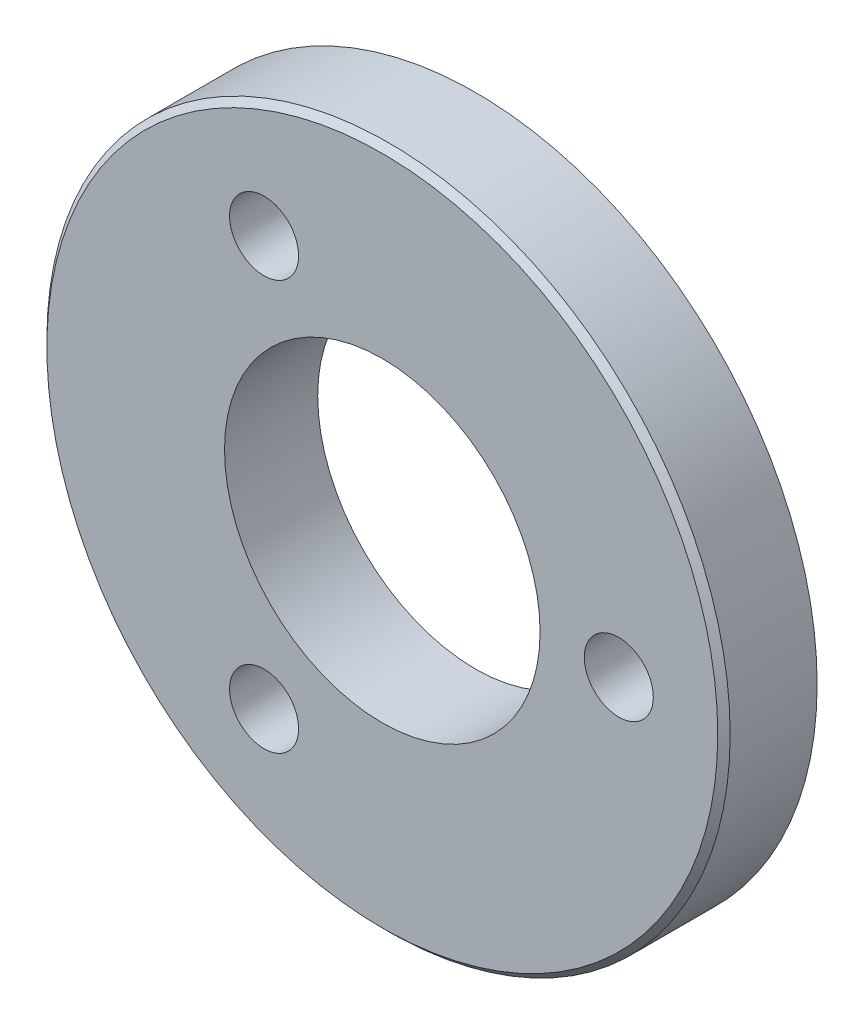
ISO-10303-21;
HEADER;
FILE_DESCRIPTION(('STEP AP214'),'2;1');
FILE_NAME('part.step','',(''),(''),'','','');
FILE_SCHEMA(('AUTOMOTIVE_DESIGN { 1 0 10303 214 1 1 1 1 }'));
ENDSEC;
DATA;
#1=APPLICATION_CONTEXT('core data for automotive mechanical design processes');
#2=APPLICATION_PROTOCOL_DEFINITION('international standard','automotive_design',2000,#1);
#3=PRODUCT_CONTEXT('',#1,'mechanical');
#4=PRODUCT('Part','Part','',(#3));
#5=PRODUCT_RELATED_PRODUCT_CATEGORY('part','',(#4));
#6=PRODUCT_DEFINITION_FORMATION('','',#4);
#7=PRODUCT_DEFINITION_CONTEXT('part definition',#1,'design');
#8=PRODUCT_DEFINITION('design','',#6,#7);
#9=PRODUCT_DEFINITION_SHAPE('','',#8);
#10=(LENGTH_UNIT() NAMED_UNIT(*) SI_UNIT(.MILLI.,.METRE.));
#11=(NAMED_UNIT(*) PLANE_ANGLE_UNIT() SI_UNIT($,.RADIAN.));
#12=(NAMED_UNIT(*) SI_UNIT($,.STERADIAN.) SOLID_ANGLE_UNIT());
#13=UNCERTAINTY_MEASURE_WITH_UNIT(LENGTH_MEASURE(1.E-05),#10,'distance_accuracy_value','');
#14=(GEOMETRIC_REPRESENTATION_CONTEXT(3) GLOBAL_UNCERTAINTY_ASSIGNED_CONTEXT((#13)) GLOBAL_UNIT_ASSIGNED_CONTEXT((#10,
#11,#12)) REPRESENTATION_CONTEXT('',''));
#15=CARTESIAN_POINT('',(0.,0.,0.));
#16=DIRECTION('',(0.,0.,1.));
#17=DIRECTION('',(1.,0.,0.));
#18=AXIS2_PLACEMENT_3D('',#15,#16,#17);
#19=CARTESIAN_POINT('',(0.,0.,7.5));
#20=DIRECTION('',(0.,0.,1.));
#21=DIRECTION('',(1.,0.,0.));
#22=AXIS2_PLACEMENT_3D('',#19,#20,#21);
#23=PLANE('',#22);
#24=CARTESIAN_POINT('',(0.,0.,7.5));
#25=DIRECTION('',(0.,0.,1.));
#26=DIRECTION('',(1.,0.,0.));
#27=AXIS2_PLACEMENT_3D('',#24,#25,#26);
#28=CIRCLE('',#27,27.);
#29=CARTESIAN_POINT('',(27.,0.,7.5));
#30=VERTEX_POINT('',#29);
#31=EDGE_CURVE('E56',#30,#30,#28,.T.);
#32=ORIENTED_EDGE('',*,*,#31,.T.);
#33=EDGE_LOOP('',(#32));
#34=FACE_BOUND('',#33,.T.);
#35=CARTESIAN_POINT('',(-9.51706249999936,-16.4840357888085,7.5));
#36=DIRECTION('',(0.,0.,1.));
#37=DIRECTION('',(1.,0.,0.));
#38=AXIS2_PLACEMENT_3D('',#35,#36,#37);
#39=CIRCLE('',#38,2.778125);
#40=CARTESIAN_POINT('',(-6.73893749999936,-16.4840357888085,7.5));
#41=VERTEX_POINT('',#40);
#42=EDGE_CURVE('E81',#41,#41,#39,.T.);
#43=ORIENTED_EDGE('',*,*,#42,.F.);
#44=EDGE_LOOP('',(#43));
#45=FACE_BOUND('',#44,.T.);
#46=CARTESIAN_POINT('',(-9.51706249999937,16.4840357888085,7.5));
#47=DIRECTION('',(0.,0.,1.));
#48=DIRECTION('',(1.,0.,0.));
#49=AXIS2_PLACEMENT_3D('',#46,#47,#48);
#50=CIRCLE('',#49,2.778125);
#51=CARTESIAN_POINT('',(-6.73893749999937,16.4840357888085,7.5));
#52=VERTEX_POINT('',#51);
#53=EDGE_CURVE('E66',#52,#52,#50,.T.);
#54=ORIENTED_EDGE('',*,*,#53,.F.);
#55=EDGE_LOOP('',(#54));
#56=FACE_BOUND('',#55,.T.);
#57=CARTESIAN_POINT('',(19.0341250000006,0.,7.5));
#58=DIRECTION('',(0.,0.,1.));
#59=DIRECTION('',(1.,0.,0.));
#60=AXIS2_PLACEMENT_3D('',#57,#58,#59);
#61=CIRCLE('',#60,2.778125);
#62=CARTESIAN_POINT('',(21.8122500000006,0.,7.5));
#63=VERTEX_POINT('',#62);
#64=EDGE_CURVE('E73',#63,#63,#61,.T.);
#65=ORIENTED_EDGE('',*,*,#64,.F.);
#66=EDGE_LOOP('',(#65));
#67=FACE_BOUND('',#66,.T.);
#68=CARTESIAN_POINT('',(0.,0.,7.5));
#69=DIRECTION('',(0.,0.,1.));
#70=DIRECTION('',(1.,0.,0.));
#71=AXIS2_PLACEMENT_3D('',#68,#69,#70);
#72=CIRCLE('',#71,12.7);
#73=CARTESIAN_POINT('',(12.7,0.,7.5));
#74=VERTEX_POINT('',#73);
#75=EDGE_CURVE('E89',#74,#74,#72,.T.);
#76=ORIENTED_EDGE('',*,*,#75,.F.);
#77=EDGE_LOOP('',(#76));
#78=FACE_BOUND('',#77,.T.);
#79=ADVANCED_FACE('F47',(#34,#45,#56,#67,#78),#23,.T.);
#80=CARTESIAN_POINT('',(0.,0.,0.));
#81=DIRECTION('',(0.,0.,1.));
#82=DIRECTION('',(1.,0.,0.));
#83=AXIS2_PLACEMENT_3D('',#80,#81,#82);
#84=PLANE('',#83);
#85=CARTESIAN_POINT('',(0.,0.,0.));
#86=DIRECTION('',(0.,0.,1.));
#87=DIRECTION('',(1.,0.,0.));
#88=AXIS2_PLACEMENT_3D('',#85,#86,#87);
#89=CIRCLE('',#88,27.5);
#90=CARTESIAN_POINT('',(27.5,0.,0.));
#91=VERTEX_POINT('',#90);
#92=EDGE_CURVE('E61',#91,#91,#89,.T.);
#93=ORIENTED_EDGE('',*,*,#92,.F.);
#94=EDGE_LOOP('',(#93));
#95=FACE_BOUND('',#94,.T.);
#96=CARTESIAN_POINT('',(-9.51706249999937,16.4840357888085,0.));
#97=DIRECTION('',(0.,0.,1.));
#98=DIRECTION('',(1.,0.,0.));
#99=AXIS2_PLACEMENT_3D('',#96,#97,#98);
#100=CIRCLE('',#99,2.778125);
#101=CARTESIAN_POINT('',(-6.73893749999937,16.4840357888085,0.));
#102=VERTEX_POINT('',#101);
#103=EDGE_CURVE('E69',#102,#102,#100,.T.);
#104=ORIENTED_EDGE('',*,*,#103,.T.);
#105=EDGE_LOOP('',(#104));
#106=FACE_BOUND('',#105,.T.);
#107=CARTESIAN_POINT('',(19.0341250000006,0.,0.));
#108=DIRECTION('',(0.,0.,1.));
#109=DIRECTION('',(1.,0.,0.));
#110=AXIS2_PLACEMENT_3D('',#107,#108,#109);
#111=CIRCLE('',#110,2.778125);
#112=CARTESIAN_POINT('',(21.8122500000006,0.,0.));
#113=VERTEX_POINT('',#112);
#114=EDGE_CURVE('E77',#113,#113,#111,.T.);
#115=ORIENTED_EDGE('',*,*,#114,.T.);
#116=EDGE_LOOP('',(#115));
#117=FACE_BOUND('',#116,.T.);
#118=CARTESIAN_POINT('',(-9.51706249999936,-16.4840357888085,0.));
#119=DIRECTION('',(0.,0.,1.));
#120=DIRECTION('',(1.,0.,0.));
#121=AXIS2_PLACEMENT_3D('',#118,#119,#120);
#122=CIRCLE('',#121,2.778125);
#123=CARTESIAN_POINT('',(-6.73893749999936,-16.4840357888085,0.));
#124=VERTEX_POINT('',#123);
#125=EDGE_CURVE('E85',#124,#124,#122,.T.);
#126=ORIENTED_EDGE('',*,*,#125,.T.);
#127=EDGE_LOOP('',(#126));
#128=FACE_BOUND('',#127,.T.);
#129=CARTESIAN_POINT('',(0.,0.,0.));
#130=DIRECTION('',(0.,0.,1.));
#131=DIRECTION('',(1.,0.,0.));
#132=AXIS2_PLACEMENT_3D('',#129,#130,#131);
#133=CIRCLE('',#132,12.7);
#134=CARTESIAN_POINT('',(12.7,0.,0.));
#135=VERTEX_POINT('',#134);
#136=EDGE_CURVE('E93',#135,#135,#133,.T.);
#137=ORIENTED_EDGE('',*,*,#136,.T.);
#138=EDGE_LOOP('',(#137));
#139=FACE_BOUND('',#138,.T.);
#140=ADVANCED_FACE('F105',(#95,#106,#117,#128,#139),#84,.F.);
#141=CARTESIAN_POINT('',(0.,0.,7.5));
#142=DIRECTION('',(0.,0.,-1.));
#143=DIRECTION('',(-1.,0.,0.));
#144=AXIS2_PLACEMENT_3D('',#141,#142,#143);
#145=CYLINDRICAL_SURFACE('',#144,27.5);
#146=CARTESIAN_POINT('',(0.,0.,7.00000000000001));
#147=DIRECTION('',(0.,0.,1.));
#148=DIRECTION('',(1.,0.,0.));
#149=AXIS2_PLACEMENT_3D('',#146,#147,#148);
#150=CIRCLE('',#149,27.5);
#151=CARTESIAN_POINT('',(27.5,0.,7.00000000000001));
#152=VERTEX_POINT('',#151);
#153=EDGE_CURVE('E10',#152,#152,#150,.F.);
#154=ORIENTED_EDGE('',*,*,#153,.T.);
#155=EDGE_LOOP('',(#154));
#156=FACE_BOUND('',#155,.T.);
#157=ORIENTED_EDGE('',*,*,#92,.T.);
#158=EDGE_LOOP('',(#157));
#159=FACE_BOUND('',#158,.T.);
#160=ADVANCED_FACE('F111',(#156,#159),#145,.T.);
#161=CARTESIAN_POINT('',(-9.51706249999937,16.4840357888085,7.5));
#162=DIRECTION('',(0.,0.,-1.));
#163=DIRECTION('',(-1.,0.,0.));
#164=AXIS2_PLACEMENT_3D('',#161,#162,#163);
#165=CYLINDRICAL_SURFACE('',#164,2.778125);
#166=ORIENTED_EDGE('',*,*,#53,.T.);
#167=EDGE_LOOP('',(#166));
#168=FACE_BOUND('',#167,.T.);
#169=ORIENTED_EDGE('',*,*,#103,.F.);
#170=EDGE_LOOP('',(#169));
#171=FACE_BOUND('',#170,.T.);
#172=ADVANCED_FACE('F116',(#168,#171),#165,.F.);
#173=CARTESIAN_POINT('',(19.0341250000006,0.,7.5));
#174=DIRECTION('',(0.,0.,-1.));
#175=DIRECTION('',(-1.,0.,0.));
#176=AXIS2_PLACEMENT_3D('',#173,#174,#175);
#177=CYLINDRICAL_SURFACE('',#176,2.778125);
#178=ORIENTED_EDGE('',*,*,#64,.T.);
#179=EDGE_LOOP('',(#178));
#180=FACE_BOUND('',#179,.T.);
#181=ORIENTED_EDGE('',*,*,#114,.F.);
#182=EDGE_LOOP('',(#181));
#183=FACE_BOUND('',#182,.T.);
#184=ADVANCED_FACE('F120',(#180,#183),#177,.F.);
#185=CARTESIAN_POINT('',(-9.51706249999936,-16.4840357888085,7.5));
#186=DIRECTION('',(0.,0.,-1.));
#187=DIRECTION('',(-1.,0.,0.));
#188=AXIS2_PLACEMENT_3D('',#185,#186,#187);
#189=CYLINDRICAL_SURFACE('',#188,2.778125);
#190=ORIENTED_EDGE('',*,*,#42,.T.);
#191=EDGE_LOOP('',(#190));
#192=FACE_BOUND('',#191,.T.);
#193=ORIENTED_EDGE('',*,*,#125,.F.);
#194=EDGE_LOOP('',(#193));
#195=FACE_BOUND('',#194,.T.);
#196=ADVANCED_FACE('F133',(#192,#195),#189,.F.);
#197=CARTESIAN_POINT('',(0.,0.,7.5));
#198=DIRECTION('',(0.,0.,-1.));
#199=DIRECTION('',(-1.,0.,0.));
#200=AXIS2_PLACEMENT_3D('',#197,#198,#199);
#201=CYLINDRICAL_SURFACE('',#200,12.7);
#202=ORIENTED_EDGE('',*,*,#75,.T.);
#203=EDGE_LOOP('',(#202));
#204=FACE_BOUND('',#203,.T.);
#205=ORIENTED_EDGE('',*,*,#136,.F.);
#206=EDGE_LOOP('',(#205));
#207=FACE_BOUND('',#206,.T.);
#208=ADVANCED_FACE('F101',(#204,#207),#201,.F.);
#209=CARTESIAN_POINT('',(0.,0.,7.5));
#210=DIRECTION('',(0.,0.,-1.));
#211=DIRECTION('',(-1.,0.,0.));
#212=AXIS2_PLACEMENT_3D('',#209,#210,#211);
#213=CONICAL_SURFACE('',#212,27.,0.785398163397448);
#214=ORIENTED_EDGE('',*,*,#153,.F.);
#215=EDGE_LOOP('',(#214));
#216=FACE_BOUND('',#215,.T.);
#217=ORIENTED_EDGE('',*,*,#31,.F.);
#218=EDGE_LOOP('',(#217));
#219=FACE_BOUND('',#218,.T.);
#220=ADVANCED_FACE('F50',(#216,#219),#213,.T.);
#221=CLOSED_SHELL('',(#79,#140,#160,#172,#184,#196,#208,#220));
#222=MANIFOLD_SOLID_BREP('B2',#221);
#223=ADVANCED_BREP_SHAPE_REPRESENTATION('',(#18,#222),#14);
#224=SHAPE_DEFINITION_REPRESENTATION(#9,#223);
ENDSEC;
END-ISO-10303-21;
